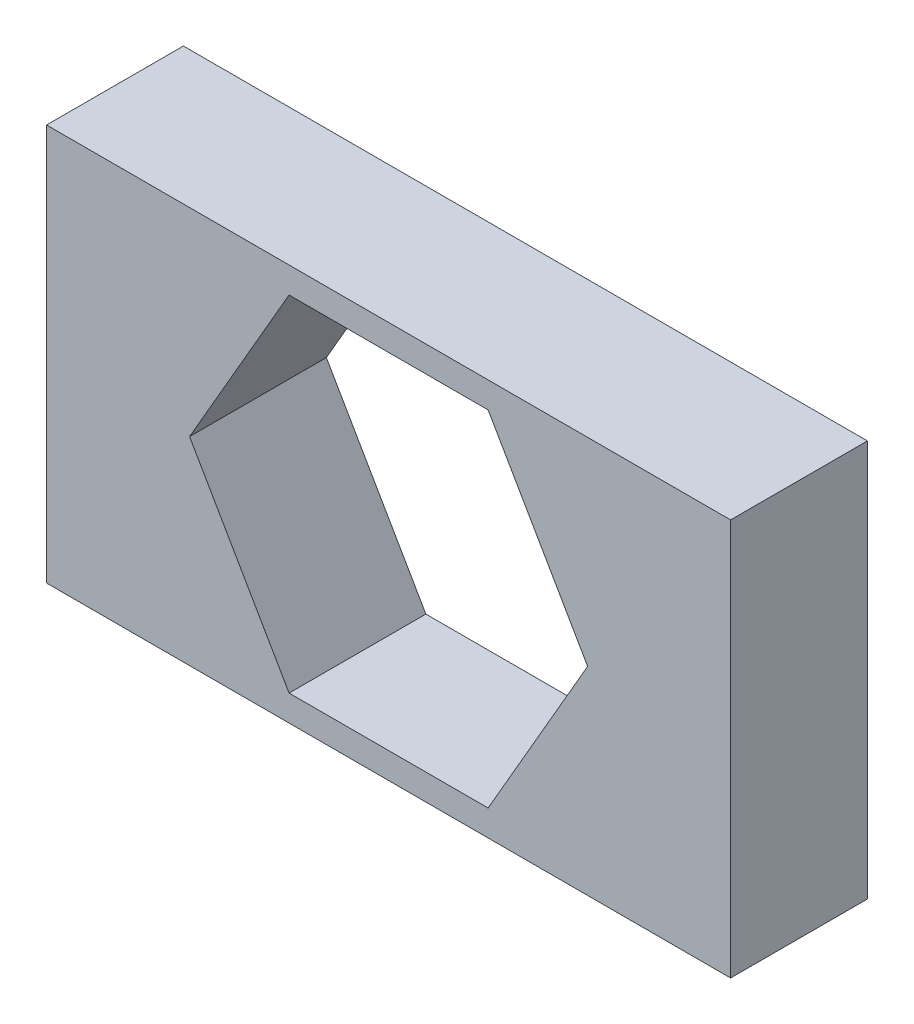
ISO-10303-21;
HEADER;
FILE_DESCRIPTION(('STEP AP214'),'2;1');
FILE_NAME('part.step','',(''),(''),'','','');
FILE_SCHEMA(('AUTOMOTIVE_DESIGN { 1 0 10303 214 1 1 1 1 }'));
ENDSEC;
DATA;
#1=APPLICATION_CONTEXT('core data for automotive mechanical design processes');
#2=APPLICATION_PROTOCOL_DEFINITION('international standard','automotive_design',2000,#1);
#3=PRODUCT_CONTEXT('',#1,'mechanical');
#4=PRODUCT('Part','Part','',(#3));
#5=PRODUCT_RELATED_PRODUCT_CATEGORY('part','',(#4));
#6=PRODUCT_DEFINITION_FORMATION('','',#4);
#7=PRODUCT_DEFINITION_CONTEXT('part definition',#1,'design');
#8=PRODUCT_DEFINITION('design','',#6,#7);
#9=PRODUCT_DEFINITION_SHAPE('','',#8);
#10=(LENGTH_UNIT() NAMED_UNIT(*) SI_UNIT(.MILLI.,.METRE.));
#11=(NAMED_UNIT(*) PLANE_ANGLE_UNIT() SI_UNIT($,.RADIAN.));
#12=(NAMED_UNIT(*) SI_UNIT($,.STERADIAN.) SOLID_ANGLE_UNIT());
#13=UNCERTAINTY_MEASURE_WITH_UNIT(LENGTH_MEASURE(1.E-05),#10,'distance_accuracy_value','');
#14=(GEOMETRIC_REPRESENTATION_CONTEXT(3) GLOBAL_UNCERTAINTY_ASSIGNED_CONTEXT((#13)) GLOBAL_UNIT_ASSIGNED_CONTEXT((#10,
#11,#12)) REPRESENTATION_CONTEXT('',''));
#15=CARTESIAN_POINT('',(0.,0.,0.));
#16=DIRECTION('',(0.,0.,1.));
#17=DIRECTION('',(1.,0.,0.));
#18=AXIS2_PLACEMENT_3D('',#15,#16,#17);
#19=CARTESIAN_POINT('',(0.,0.,5.));
#20=DIRECTION('',(0.,0.,-1.));
#21=DIRECTION('',(-1.,0.,0.));
#22=AXIS2_PLACEMENT_3D('',#19,#20,#21);
#23=PLANE('',#22);
#24=DIRECTION('',(0.,-1.,0.));
#25=VECTOR('',#24,1.);
#26=CARTESIAN_POINT('',(0.,0.,5.));
#27=LINE('',#26,#25);
#28=CARTESIAN_POINT('',(0.,14.5,5.));
#29=VERTEX_POINT('',#28);
#30=CARTESIAN_POINT('',(0.,0.,5.));
#31=VERTEX_POINT('',#30);
#32=EDGE_CURVE('E161',#29,#31,#27,.T.);
#33=ORIENTED_EDGE('',*,*,#32,.T.);
#34=DIRECTION('',(1.,0.,0.));
#35=VECTOR('',#34,1.);
#36=CARTESIAN_POINT('',(0.,0.,5.));
#37=LINE('',#36,#35);
#38=CARTESIAN_POINT('',(25.,0.,5.));
#39=VERTEX_POINT('',#38);
#40=EDGE_CURVE('E164',#31,#39,#37,.T.);
#41=ORIENTED_EDGE('',*,*,#40,.T.);
#42=DIRECTION('',(0.,1.,0.));
#43=VECTOR('',#42,1.);
#44=CARTESIAN_POINT('',(25.,0.,5.));
#45=LINE('',#44,#43);
#46=CARTESIAN_POINT('',(25.,14.5,5.));
#47=VERTEX_POINT('',#46);
#48=EDGE_CURVE('E167',#39,#47,#45,.T.);
#49=ORIENTED_EDGE('',*,*,#48,.T.);
#50=DIRECTION('',(-1.,0.,0.));
#51=VECTOR('',#50,1.);
#52=CARTESIAN_POINT('',(0.,14.5,5.));
#53=LINE('',#52,#51);
#54=EDGE_CURVE('E169',#47,#29,#53,.T.);
#55=ORIENTED_EDGE('',*,*,#54,.T.);
#56=EDGE_LOOP('',(#33,#41,#49,#55));
#57=FACE_BOUND('',#56,.T.);
#58=DIRECTION('',(0.5,0.866025403784439,0.));
#59=VECTOR('',#58,1.);
#60=CARTESIAN_POINT('',(16.1373066958946,0.949999999999999,5.));
#61=LINE('',#60,#59);
#62=CARTESIAN_POINT('',(16.1373066958946,0.949999999999999,5.));
#63=VERTEX_POINT('',#62);
#64=CARTESIAN_POINT('',(19.7746133917893,7.25,5.));
#65=VERTEX_POINT('',#64);
#66=EDGE_CURVE('E110',#63,#65,#61,.T.);
#67=ORIENTED_EDGE('',*,*,#66,.F.);
#68=DIRECTION('',(1.,0.,0.));
#69=VECTOR('',#68,1.);
#70=CARTESIAN_POINT('',(8.86269330410535,0.950000000000003,5.));
#71=LINE('',#70,#69);
#72=CARTESIAN_POINT('',(8.86269330410535,0.950000000000003,5.));
#73=VERTEX_POINT('',#72);
#74=EDGE_CURVE('E139',#73,#63,#71,.T.);
#75=ORIENTED_EDGE('',*,*,#74,.F.);
#76=DIRECTION('',(0.5,-0.866025403784439,0.));
#77=VECTOR('',#76,1.);
#78=CARTESIAN_POINT('',(5.22538660821071,7.25000000000001,5.));
#79=LINE('',#78,#77);
#80=CARTESIAN_POINT('',(5.22538660821071,7.25000000000001,5.));
#81=VERTEX_POINT('',#80);
#82=EDGE_CURVE('E137',#81,#73,#79,.T.);
#83=ORIENTED_EDGE('',*,*,#82,.F.);
#84=DIRECTION('',(-0.5,-0.866025403784438,0.));
#85=VECTOR('',#84,1.);
#86=CARTESIAN_POINT('',(8.86269330410536,13.55,5.));
#87=LINE('',#86,#85);
#88=CARTESIAN_POINT('',(8.86269330410536,13.55,5.));
#89=VERTEX_POINT('',#88);
#90=EDGE_CURVE('E133',#89,#81,#87,.T.);
#91=ORIENTED_EDGE('',*,*,#90,.F.);
#92=DIRECTION('',(-1.,0.,0.));
#93=VECTOR('',#92,1.);
#94=CARTESIAN_POINT('',(16.1373066958946,13.55,5.));
#95=LINE('',#94,#93);
#96=CARTESIAN_POINT('',(16.1373066958946,13.55,5.));
#97=VERTEX_POINT('',#96);
#98=EDGE_CURVE('E131',#97,#89,#95,.T.);
#99=ORIENTED_EDGE('',*,*,#98,.F.);
#100=DIRECTION('',(-0.5,0.866025403784439,0.));
#101=VECTOR('',#100,1.);
#102=CARTESIAN_POINT('',(19.7746133917893,7.25,5.));
#103=LINE('',#102,#101);
#104=EDGE_CURVE('E118',#65,#97,#103,.T.);
#105=ORIENTED_EDGE('',*,*,#104,.F.);
#106=EDGE_LOOP('',(#67,#75,#83,#91,#99,#105));
#107=FACE_BOUND('',#106,.T.);
#108=ADVANCED_FACE('F33',(#57,#107),#23,.F.);
#109=CARTESIAN_POINT('',(0.,0.,0.));
#110=DIRECTION('',(0.,0.,-1.));
#111=DIRECTION('',(-1.,0.,0.));
#112=AXIS2_PLACEMENT_3D('',#109,#110,#111);
#113=PLANE('',#112);
#114=DIRECTION('',(0.,-1.,0.));
#115=VECTOR('',#114,1.);
#116=CARTESIAN_POINT('',(0.,0.,0.));
#117=LINE('',#116,#115);
#118=CARTESIAN_POINT('',(0.,14.5,0.));
#119=VERTEX_POINT('',#118);
#120=CARTESIAN_POINT('',(0.,0.,0.));
#121=VERTEX_POINT('',#120);
#122=EDGE_CURVE('E126',#119,#121,#117,.T.);
#123=ORIENTED_EDGE('',*,*,#122,.F.);
#124=DIRECTION('',(-1.,0.,0.));
#125=VECTOR('',#124,1.);
#126=CARTESIAN_POINT('',(0.,14.5,0.));
#127=LINE('',#126,#125);
#128=CARTESIAN_POINT('',(25.,14.5,0.));
#129=VERTEX_POINT('',#128);
#130=EDGE_CURVE('E165',#129,#119,#127,.T.);
#131=ORIENTED_EDGE('',*,*,#130,.F.);
#132=DIRECTION('',(0.,1.,0.));
#133=VECTOR('',#132,1.);
#134=CARTESIAN_POINT('',(25.,0.,0.));
#135=LINE('',#134,#133);
#136=CARTESIAN_POINT('',(25.,0.,0.));
#137=VERTEX_POINT('',#136);
#138=EDGE_CURVE('E176',#137,#129,#135,.T.);
#139=ORIENTED_EDGE('',*,*,#138,.F.);
#140=DIRECTION('',(1.,0.,0.));
#141=VECTOR('',#140,1.);
#142=CARTESIAN_POINT('',(0.,0.,0.));
#143=LINE('',#142,#141);
#144=EDGE_CURVE('E174',#121,#137,#143,.T.);
#145=ORIENTED_EDGE('',*,*,#144,.F.);
#146=EDGE_LOOP('',(#123,#131,#139,#145));
#147=FACE_BOUND('',#146,.T.);
#148=DIRECTION('',(1.,0.,0.));
#149=VECTOR('',#148,1.);
#150=CARTESIAN_POINT('',(8.86269330410535,0.950000000000003,0.));
#151=LINE('',#150,#149);
#152=CARTESIAN_POINT('',(8.86269330410535,0.950000000000003,0.));
#153=VERTEX_POINT('',#152);
#154=CARTESIAN_POINT('',(16.1373066958946,0.949999999999999,0.));
#155=VERTEX_POINT('',#154);
#156=EDGE_CURVE('E119',#153,#155,#151,.T.);
#157=ORIENTED_EDGE('',*,*,#156,.T.);
#158=DIRECTION('',(0.5,0.866025403784439,0.));
#159=VECTOR('',#158,1.);
#160=CARTESIAN_POINT('',(16.1373066958946,0.949999999999999,0.));
#161=LINE('',#160,#159);
#162=CARTESIAN_POINT('',(19.7746133917893,7.25,0.));
#163=VERTEX_POINT('',#162);
#164=EDGE_CURVE('E56',#155,#163,#161,.T.);
#165=ORIENTED_EDGE('',*,*,#164,.T.);
#166=DIRECTION('',(-0.5,0.866025403784439,0.));
#167=VECTOR('',#166,1.);
#168=CARTESIAN_POINT('',(19.7746133917893,7.25,0.));
#169=LINE('',#168,#167);
#170=CARTESIAN_POINT('',(16.1373066958946,13.55,0.));
#171=VERTEX_POINT('',#170);
#172=EDGE_CURVE('E125',#163,#171,#169,.T.);
#173=ORIENTED_EDGE('',*,*,#172,.T.);
#174=DIRECTION('',(-1.,0.,0.));
#175=VECTOR('',#174,1.);
#176=CARTESIAN_POINT('',(16.1373066958946,13.55,0.));
#177=LINE('',#176,#175);
#178=CARTESIAN_POINT('',(8.86269330410536,13.55,0.));
#179=VERTEX_POINT('',#178);
#180=EDGE_CURVE('E143',#171,#179,#177,.T.);
#181=ORIENTED_EDGE('',*,*,#180,.T.);
#182=DIRECTION('',(-0.5,-0.866025403784438,0.));
#183=VECTOR('',#182,1.);
#184=CARTESIAN_POINT('',(8.86269330410536,13.55,0.));
#185=LINE('',#184,#183);
#186=CARTESIAN_POINT('',(5.22538660821071,7.25000000000001,0.));
#187=VERTEX_POINT('',#186);
#188=EDGE_CURVE('E146',#179,#187,#185,.T.);
#189=ORIENTED_EDGE('',*,*,#188,.T.);
#190=DIRECTION('',(0.5,-0.866025403784439,0.));
#191=VECTOR('',#190,1.);
#192=CARTESIAN_POINT('',(5.22538660821071,7.25000000000001,0.));
#193=LINE('',#192,#191);
#194=EDGE_CURVE('E149',#187,#153,#193,.T.);
#195=ORIENTED_EDGE('',*,*,#194,.T.);
#196=EDGE_LOOP('',(#157,#165,#173,#181,#189,#195));
#197=FACE_BOUND('',#196,.T.);
#198=ADVANCED_FACE('F194',(#147,#197),#113,.T.);
#199=CARTESIAN_POINT('',(0.,0.,5.));
#200=DIRECTION('',(1.,0.,0.));
#201=DIRECTION('',(0.,1.,0.));
#202=AXIS2_PLACEMENT_3D('',#199,#200,#201);
#203=PLANE('',#202);
#204=ORIENTED_EDGE('',*,*,#122,.T.);
#205=DIRECTION('',(0.,0.,-1.));
#206=VECTOR('',#205,1.);
#207=CARTESIAN_POINT('',(0.,0.,5.));
#208=LINE('',#207,#206);
#209=EDGE_CURVE('E11',#31,#121,#208,.T.);
#210=ORIENTED_EDGE('',*,*,#209,.F.);
#211=ORIENTED_EDGE('',*,*,#32,.F.);
#212=DIRECTION('',(0.,0.,-1.));
#213=VECTOR('',#212,1.);
#214=CARTESIAN_POINT('',(0.,14.5,5.));
#215=LINE('',#214,#213);
#216=EDGE_CURVE('E171',#29,#119,#215,.T.);
#217=ORIENTED_EDGE('',*,*,#216,.T.);
#218=EDGE_LOOP('',(#204,#210,#211,#217));
#219=FACE_BOUND('',#218,.T.);
#220=ADVANCED_FACE('F35',(#219),#203,.F.);
#221=CARTESIAN_POINT('',(0.,0.,5.));
#222=DIRECTION('',(0.,1.,0.));
#223=DIRECTION('',(-1.,0.,0.));
#224=AXIS2_PLACEMENT_3D('',#221,#222,#223);
#225=PLANE('',#224);
#226=ORIENTED_EDGE('',*,*,#144,.T.);
#227=DIRECTION('',(0.,0.,-1.));
#228=VECTOR('',#227,1.);
#229=CARTESIAN_POINT('',(25.,0.,5.));
#230=LINE('',#229,#228);
#231=EDGE_CURVE('E41',#39,#137,#230,.T.);
#232=ORIENTED_EDGE('',*,*,#231,.F.);
#233=ORIENTED_EDGE('',*,*,#40,.F.);
#234=ORIENTED_EDGE('',*,*,#209,.T.);
#235=EDGE_LOOP('',(#226,#232,#233,#234));
#236=FACE_BOUND('',#235,.T.);
#237=ADVANCED_FACE('F204',(#236),#225,.F.);
#238=CARTESIAN_POINT('',(25.,0.,5.));
#239=DIRECTION('',(-1.,0.,0.));
#240=DIRECTION('',(0.,0.,1.));
#241=AXIS2_PLACEMENT_3D('',#238,#239,#240);
#242=PLANE('',#241);
#243=ORIENTED_EDGE('',*,*,#138,.T.);
#244=DIRECTION('',(0.,0.,-1.));
#245=VECTOR('',#244,1.);
#246=CARTESIAN_POINT('',(25.,14.5,5.));
#247=LINE('',#246,#245);
#248=EDGE_CURVE('E181',#47,#129,#247,.T.);
#249=ORIENTED_EDGE('',*,*,#248,.F.);
#250=ORIENTED_EDGE('',*,*,#48,.F.);
#251=ORIENTED_EDGE('',*,*,#231,.T.);
#252=EDGE_LOOP('',(#243,#249,#250,#251));
#253=FACE_BOUND('',#252,.T.);
#254=ADVANCED_FACE('F188',(#253),#242,.F.);
#255=CARTESIAN_POINT('',(0.,14.5,5.));
#256=DIRECTION('',(0.,-1.,0.));
#257=DIRECTION('',(0.,0.,-1.));
#258=AXIS2_PLACEMENT_3D('',#255,#256,#257);
#259=PLANE('',#258);
#260=ORIENTED_EDGE('',*,*,#130,.T.);
#261=ORIENTED_EDGE('',*,*,#216,.F.);
#262=ORIENTED_EDGE('',*,*,#54,.F.);
#263=ORIENTED_EDGE('',*,*,#248,.T.);
#264=EDGE_LOOP('',(#260,#261,#262,#263));
#265=FACE_BOUND('',#264,.T.);
#266=ADVANCED_FACE('F198',(#265),#259,.F.);
#267=CARTESIAN_POINT('',(16.1373066958946,0.949999999999999,5.));
#268=DIRECTION('',(-0.866025403784439,0.5,0.));
#269=DIRECTION('',(-0.5,-0.866025403784439,0.));
#270=AXIS2_PLACEMENT_3D('',#267,#268,#269);
#271=PLANE('',#270);
#272=ORIENTED_EDGE('',*,*,#164,.F.);
#273=DIRECTION('',(0.,0.,-1.));
#274=VECTOR('',#273,1.);
#275=CARTESIAN_POINT('',(16.1373066958946,0.949999999999999,5.));
#276=LINE('',#275,#274);
#277=EDGE_CURVE('E114',#63,#155,#276,.T.);
#278=ORIENTED_EDGE('',*,*,#277,.F.);
#279=ORIENTED_EDGE('',*,*,#66,.T.);
#280=DIRECTION('',(0.,0.,-1.));
#281=VECTOR('',#280,1.);
#282=CARTESIAN_POINT('',(19.7746133917893,7.25,5.));
#283=LINE('',#282,#281);
#284=EDGE_CURVE('E113',#65,#163,#283,.T.);
#285=ORIENTED_EDGE('',*,*,#284,.T.);
#286=EDGE_LOOP('',(#272,#278,#279,#285));
#287=FACE_BOUND('',#286,.T.);
#288=ADVANCED_FACE('F112',(#287),#271,.T.);
#289=CARTESIAN_POINT('',(19.7746133917893,7.25,5.));
#290=DIRECTION('',(-0.866025403784439,-0.5,0.));
#291=DIRECTION('',(0.5,-0.866025403784439,0.));
#292=AXIS2_PLACEMENT_3D('',#289,#290,#291);
#293=PLANE('',#292);
#294=ORIENTED_EDGE('',*,*,#172,.F.);
#295=ORIENTED_EDGE('',*,*,#284,.F.);
#296=ORIENTED_EDGE('',*,*,#104,.T.);
#297=DIRECTION('',(0.,0.,-1.));
#298=VECTOR('',#297,1.);
#299=CARTESIAN_POINT('',(16.1373066958946,13.55,5.));
#300=LINE('',#299,#298);
#301=EDGE_CURVE('E127',#97,#171,#300,.T.);
#302=ORIENTED_EDGE('',*,*,#301,.T.);
#303=EDGE_LOOP('',(#294,#295,#296,#302));
#304=FACE_BOUND('',#303,.T.);
#305=ADVANCED_FACE('F122',(#304),#293,.T.);
#306=CARTESIAN_POINT('',(16.1373066958946,13.55,5.));
#307=DIRECTION('',(0.,-1.,0.));
#308=DIRECTION('',(1.,0.,0.));
#309=AXIS2_PLACEMENT_3D('',#306,#307,#308);
#310=PLANE('',#309);
#311=ORIENTED_EDGE('',*,*,#180,.F.);
#312=ORIENTED_EDGE('',*,*,#301,.F.);
#313=ORIENTED_EDGE('',*,*,#98,.T.);
#314=DIRECTION('',(0.,0.,-1.));
#315=VECTOR('',#314,1.);
#316=CARTESIAN_POINT('',(8.86269330410536,13.55,5.));
#317=LINE('',#316,#315);
#318=EDGE_CURVE('E158',#89,#179,#317,.T.);
#319=ORIENTED_EDGE('',*,*,#318,.T.);
#320=EDGE_LOOP('',(#311,#312,#313,#319));
#321=FACE_BOUND('',#320,.T.);
#322=ADVANCED_FACE('F227',(#321),#310,.T.);
#323=CARTESIAN_POINT('',(8.86269330410536,13.55,5.));
#324=DIRECTION('',(0.866025403784439,-0.5,0.));
#325=DIRECTION('',(0.5,0.866025403784439,0.));
#326=AXIS2_PLACEMENT_3D('',#323,#324,#325);
#327=PLANE('',#326);
#328=ORIENTED_EDGE('',*,*,#188,.F.);
#329=ORIENTED_EDGE('',*,*,#318,.F.);
#330=ORIENTED_EDGE('',*,*,#90,.T.);
#331=DIRECTION('',(0.,0.,-1.));
#332=VECTOR('',#331,1.);
#333=CARTESIAN_POINT('',(5.22538660821071,7.25000000000001,5.));
#334=LINE('',#333,#332);
#335=EDGE_CURVE('E156',#81,#187,#334,.T.);
#336=ORIENTED_EDGE('',*,*,#335,.T.);
#337=EDGE_LOOP('',(#328,#329,#330,#336));
#338=FACE_BOUND('',#337,.T.);
#339=ADVANCED_FACE('F231',(#338),#327,.T.);
#340=CARTESIAN_POINT('',(5.22538660821071,7.25000000000001,5.));
#341=DIRECTION('',(0.866025403784439,0.5,0.));
#342=DIRECTION('',(-0.5,0.866025403784439,0.));
#343=AXIS2_PLACEMENT_3D('',#340,#341,#342);
#344=PLANE('',#343);
#345=ORIENTED_EDGE('',*,*,#194,.F.);
#346=ORIENTED_EDGE('',*,*,#335,.F.);
#347=ORIENTED_EDGE('',*,*,#82,.T.);
#348=DIRECTION('',(0.,0.,-1.));
#349=VECTOR('',#348,1.);
#350=CARTESIAN_POINT('',(8.86269330410535,0.950000000000003,5.));
#351=LINE('',#350,#349);
#352=EDGE_CURVE('E48',#73,#153,#351,.T.);
#353=ORIENTED_EDGE('',*,*,#352,.T.);
#354=EDGE_LOOP('',(#345,#346,#347,#353));
#355=FACE_BOUND('',#354,.T.);
#356=ADVANCED_FACE('F237',(#355),#344,.T.);
#357=CARTESIAN_POINT('',(8.86269330410535,0.950000000000003,5.));
#358=DIRECTION('',(0.,1.,0.));
#359=DIRECTION('',(-1.,0.,0.));
#360=AXIS2_PLACEMENT_3D('',#357,#358,#359);
#361=PLANE('',#360);
#362=ORIENTED_EDGE('',*,*,#156,.F.);
#363=ORIENTED_EDGE('',*,*,#352,.F.);
#364=ORIENTED_EDGE('',*,*,#74,.T.);
#365=ORIENTED_EDGE('',*,*,#277,.T.);
#366=EDGE_LOOP('',(#362,#363,#364,#365));
#367=FACE_BOUND('',#366,.T.);
#368=ADVANCED_FACE('F241',(#367),#361,.T.);
#369=CLOSED_SHELL('',(#108,#198,#220,#237,#254,#266,#288,#305,#322,#339,#356,#368));
#370=MANIFOLD_SOLID_BREP('B2',#369);
#371=ADVANCED_BREP_SHAPE_REPRESENTATION('',(#18,#370),#14);
#372=SHAPE_DEFINITION_REPRESENTATION(#9,#371);
ENDSEC;
END-ISO-10303-21;
